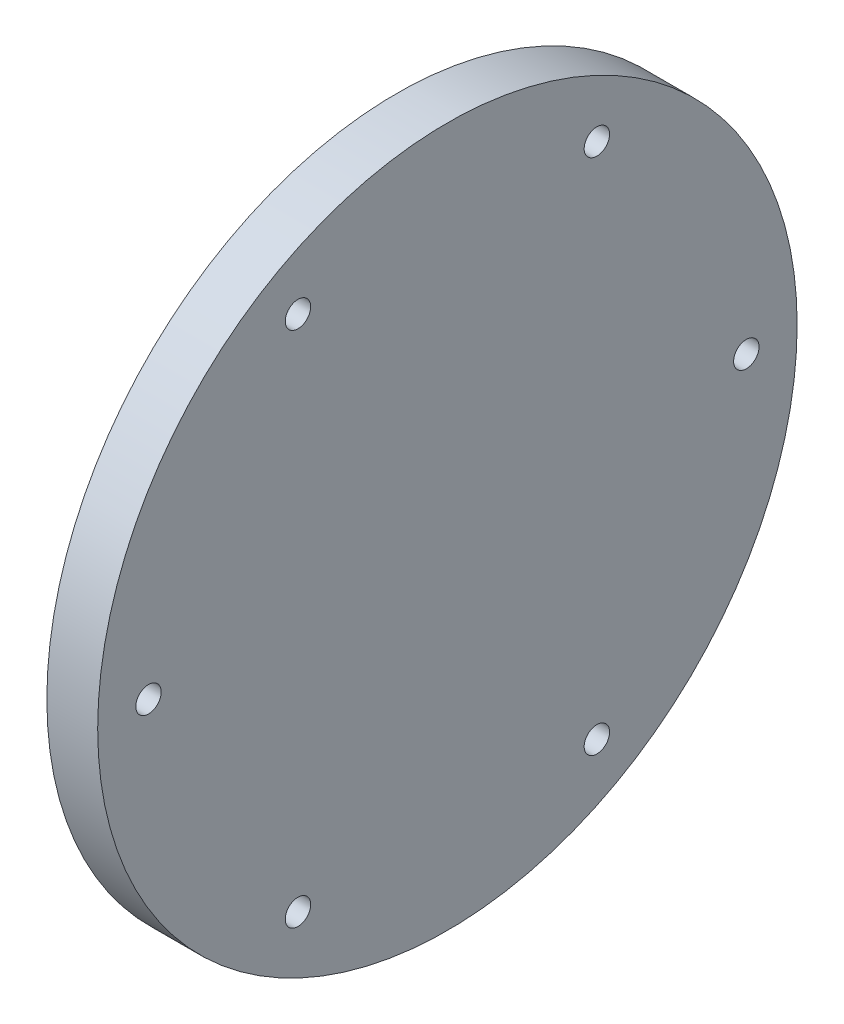
ISO-10303-21;
HEADER;
FILE_DESCRIPTION(('STEP AP214'),'2;1');
FILE_NAME('part.step','',(''),(''),'','','');
FILE_SCHEMA(('AUTOMOTIVE_DESIGN { 1 0 10303 214 1 1 1 1 }'));
ENDSEC;
DATA;
#1=APPLICATION_CONTEXT('core data for automotive mechanical design processes');
#2=APPLICATION_PROTOCOL_DEFINITION('international standard','automotive_design',2000,#1);
#3=PRODUCT_CONTEXT('',#1,'mechanical');
#4=PRODUCT('Part','Part','',(#3));
#5=PRODUCT_RELATED_PRODUCT_CATEGORY('part','',(#4));
#6=PRODUCT_DEFINITION_FORMATION('','',#4);
#7=PRODUCT_DEFINITION_CONTEXT('part definition',#1,'design');
#8=PRODUCT_DEFINITION('design','',#6,#7);
#9=PRODUCT_DEFINITION_SHAPE('','',#8);
#10=(LENGTH_UNIT() NAMED_UNIT(*) SI_UNIT(.MILLI.,.METRE.));
#11=(NAMED_UNIT(*) PLANE_ANGLE_UNIT() SI_UNIT($,.RADIAN.));
#12=(NAMED_UNIT(*) SI_UNIT($,.STERADIAN.) SOLID_ANGLE_UNIT());
#13=UNCERTAINTY_MEASURE_WITH_UNIT(LENGTH_MEASURE(1.E-05),#10,'distance_accuracy_value','');
#14=(GEOMETRIC_REPRESENTATION_CONTEXT(3) GLOBAL_UNCERTAINTY_ASSIGNED_CONTEXT((#13)) GLOBAL_UNIT_ASSIGNED_CONTEXT((#10,
#11,#12)) REPRESENTATION_CONTEXT('',''));
#15=CARTESIAN_POINT('',(0.,0.,0.));
#16=DIRECTION('',(0.,0.,1.));
#17=DIRECTION('',(1.,0.,0.));
#18=AXIS2_PLACEMENT_3D('',#15,#16,#17);
#19=CARTESIAN_POINT('',(163.7,34.4,0.));
#20=DIRECTION('',(1.,0.,0.));
#21=DIRECTION('',(0.,0.,-1.));
#22=AXIS2_PLACEMENT_3D('',#19,#20,#21);
#23=PLANE('',#22);
#24=CARTESIAN_POINT('',(163.7,0.,29.4));
#25=DIRECTION('',(1.,0.,0.));
#26=DIRECTION('',(0.,0.,-1.));
#27=AXIS2_PLACEMENT_3D('',#24,#25,#26);
#28=CIRCLE('',#27,1.25);
#29=CARTESIAN_POINT('',(163.7,0.,28.15));
#30=VERTEX_POINT('',#29);
#31=EDGE_CURVE('E50',#30,#30,#28,.F.);
#32=ORIENTED_EDGE('',*,*,#31,.F.);
#33=EDGE_LOOP('',(#32));
#34=FACE_BOUND('',#33,.T.);
#35=CARTESIAN_POINT('',(163.7,-25.4611468712625,14.7));
#36=DIRECTION('',(1.,0.,0.));
#37=DIRECTION('',(0.,0.,-1.));
#38=AXIS2_PLACEMENT_3D('',#35,#36,#37);
#39=CIRCLE('',#38,1.25);
#40=CARTESIAN_POINT('',(163.7,-25.4611468712625,13.45));
#41=VERTEX_POINT('',#40);
#42=EDGE_CURVE('E54',#41,#41,#39,.F.);
#43=ORIENTED_EDGE('',*,*,#42,.F.);
#44=EDGE_LOOP('',(#43));
#45=FACE_BOUND('',#44,.T.);
#46=CARTESIAN_POINT('',(163.7,-25.4611468712625,-14.7));
#47=DIRECTION('',(1.,0.,0.));
#48=DIRECTION('',(0.,0.,-1.));
#49=AXIS2_PLACEMENT_3D('',#46,#47,#48);
#50=CIRCLE('',#49,1.25);
#51=CARTESIAN_POINT('',(163.7,-25.4611468712625,-15.95));
#52=VERTEX_POINT('',#51);
#53=EDGE_CURVE('E59',#52,#52,#50,.F.);
#54=ORIENTED_EDGE('',*,*,#53,.F.);
#55=EDGE_LOOP('',(#54));
#56=FACE_BOUND('',#55,.T.);
#57=CARTESIAN_POINT('',(163.7,25.4611468712625,-14.7));
#58=DIRECTION('',(1.,0.,0.));
#59=DIRECTION('',(0.,0.,-1.));
#60=AXIS2_PLACEMENT_3D('',#57,#58,#59);
#61=CIRCLE('',#60,1.25);
#62=CARTESIAN_POINT('',(163.7,25.4611468712625,-15.95));
#63=VERTEX_POINT('',#62);
#64=EDGE_CURVE('E62',#63,#63,#61,.F.);
#65=ORIENTED_EDGE('',*,*,#64,.F.);
#66=EDGE_LOOP('',(#65));
#67=FACE_BOUND('',#66,.T.);
#68=CARTESIAN_POINT('',(163.7,0.,-29.4));
#69=DIRECTION('',(1.,0.,0.));
#70=DIRECTION('',(0.,0.,-1.));
#71=AXIS2_PLACEMENT_3D('',#68,#69,#70);
#72=CIRCLE('',#71,1.25);
#73=CARTESIAN_POINT('',(163.7,0.,-30.65));
#74=VERTEX_POINT('',#73);
#75=EDGE_CURVE('E65',#74,#74,#72,.F.);
#76=ORIENTED_EDGE('',*,*,#75,.F.);
#77=EDGE_LOOP('',(#76));
#78=FACE_BOUND('',#77,.T.);
#79=CARTESIAN_POINT('',(163.7,25.4611468712625,14.7));
#80=DIRECTION('',(1.,0.,0.));
#81=DIRECTION('',(0.,0.,-1.));
#82=AXIS2_PLACEMENT_3D('',#79,#80,#81);
#83=CIRCLE('',#82,1.25);
#84=CARTESIAN_POINT('',(163.7,25.4611468712625,13.45));
#85=VERTEX_POINT('',#84);
#86=EDGE_CURVE('E68',#85,#85,#83,.F.);
#87=ORIENTED_EDGE('',*,*,#86,.F.);
#88=EDGE_LOOP('',(#87));
#89=FACE_BOUND('',#88,.T.);
#90=CARTESIAN_POINT('',(163.7,0.,0.));
#91=DIRECTION('',(-1.,0.,0.));
#92=DIRECTION('',(0.,0.,1.));
#93=AXIS2_PLACEMENT_3D('',#90,#91,#92);
#94=CIRCLE('',#93,34.4);
#95=CARTESIAN_POINT('',(163.7,0.,34.4));
#96=VERTEX_POINT('',#95);
#97=EDGE_CURVE('E46',#96,#96,#94,.T.);
#98=ORIENTED_EDGE('',*,*,#97,.T.);
#99=EDGE_LOOP('',(#98));
#100=FACE_BOUND('',#99,.T.);
#101=ADVANCED_FACE('F39',(#34,#45,#56,#67,#78,#89,#100),#23,.F.);
#102=CARTESIAN_POINT('',(168.7,0.,0.));
#103=DIRECTION('',(-1.,0.,0.));
#104=DIRECTION('',(0.,0.,1.));
#105=AXIS2_PLACEMENT_3D('',#102,#103,#104);
#106=PLANE('',#105);
#107=CARTESIAN_POINT('',(168.7,0.,29.4));
#108=DIRECTION('',(1.,0.,0.));
#109=DIRECTION('',(0.,0.,-1.));
#110=AXIS2_PLACEMENT_3D('',#107,#108,#109);
#111=CIRCLE('',#110,1.25);
#112=CARTESIAN_POINT('',(168.7,0.,28.15));
#113=VERTEX_POINT('',#112);
#114=EDGE_CURVE('E71',#113,#113,#111,.T.);
#115=ORIENTED_EDGE('',*,*,#114,.F.);
#116=EDGE_LOOP('',(#115));
#117=FACE_BOUND('',#116,.T.);
#118=CARTESIAN_POINT('',(168.7,-25.4611468712625,14.7));
#119=DIRECTION('',(1.,0.,0.));
#120=DIRECTION('',(0.,0.,-1.));
#121=AXIS2_PLACEMENT_3D('',#118,#119,#120);
#122=CIRCLE('',#121,1.25);
#123=CARTESIAN_POINT('',(168.7,-25.4611468712625,13.45));
#124=VERTEX_POINT('',#123);
#125=EDGE_CURVE('E82',#124,#124,#122,.T.);
#126=ORIENTED_EDGE('',*,*,#125,.F.);
#127=EDGE_LOOP('',(#126));
#128=FACE_BOUND('',#127,.T.);
#129=CARTESIAN_POINT('',(168.7,-25.4611468712625,-14.7));
#130=DIRECTION('',(1.,0.,0.));
#131=DIRECTION('',(0.,0.,-1.));
#132=AXIS2_PLACEMENT_3D('',#129,#130,#131);
#133=CIRCLE('',#132,1.25);
#134=CARTESIAN_POINT('',(168.7,-25.4611468712625,-15.95));
#135=VERTEX_POINT('',#134);
#136=EDGE_CURVE('E75',#135,#135,#133,.T.);
#137=ORIENTED_EDGE('',*,*,#136,.F.);
#138=EDGE_LOOP('',(#137));
#139=FACE_BOUND('',#138,.T.);
#140=CARTESIAN_POINT('',(168.7,25.4611468712625,-14.7));
#141=DIRECTION('',(1.,0.,0.));
#142=DIRECTION('',(0.,0.,-1.));
#143=AXIS2_PLACEMENT_3D('',#140,#141,#142);
#144=CIRCLE('',#143,1.25);
#145=CARTESIAN_POINT('',(168.7,25.4611468712625,-15.95));
#146=VERTEX_POINT('',#145);
#147=EDGE_CURVE('E72',#146,#146,#144,.T.);
#148=ORIENTED_EDGE('',*,*,#147,.F.);
#149=EDGE_LOOP('',(#148));
#150=FACE_BOUND('',#149,.T.);
#151=CARTESIAN_POINT('',(168.7,0.,-29.4));
#152=DIRECTION('',(1.,0.,0.));
#153=DIRECTION('',(0.,0.,-1.));
#154=AXIS2_PLACEMENT_3D('',#151,#152,#153);
#155=CIRCLE('',#154,1.25);
#156=CARTESIAN_POINT('',(168.7,0.,-30.65));
#157=VERTEX_POINT('',#156);
#158=EDGE_CURVE('E76',#157,#157,#155,.T.);
#159=ORIENTED_EDGE('',*,*,#158,.F.);
#160=EDGE_LOOP('',(#159));
#161=FACE_BOUND('',#160,.T.);
#162=CARTESIAN_POINT('',(168.7,25.4611468712625,14.7));
#163=DIRECTION('',(1.,0.,0.));
#164=DIRECTION('',(0.,0.,-1.));
#165=AXIS2_PLACEMENT_3D('',#162,#163,#164);
#166=CIRCLE('',#165,1.25);
#167=CARTESIAN_POINT('',(168.7,25.4611468712625,13.45));
#168=VERTEX_POINT('',#167);
#169=EDGE_CURVE('E79',#168,#168,#166,.T.);
#170=ORIENTED_EDGE('',*,*,#169,.F.);
#171=EDGE_LOOP('',(#170));
#172=FACE_BOUND('',#171,.T.);
#173=CARTESIAN_POINT('',(168.7,0.,0.));
#174=DIRECTION('',(-1.,0.,0.));
#175=DIRECTION('',(0.,0.,1.));
#176=AXIS2_PLACEMENT_3D('',#173,#174,#175);
#177=CIRCLE('',#176,34.4);
#178=CARTESIAN_POINT('',(168.7,0.,34.4));
#179=VERTEX_POINT('',#178);
#180=EDGE_CURVE('E10',#179,#179,#177,.T.);
#181=ORIENTED_EDGE('',*,*,#180,.F.);
#182=EDGE_LOOP('',(#181));
#183=FACE_BOUND('',#182,.T.);
#184=ADVANCED_FACE('F93',(#117,#128,#139,#150,#161,#172,#183),#106,.F.);
#185=CARTESIAN_POINT('',(-110.,0.,0.));
#186=DIRECTION('',(-1.,0.,0.));
#187=DIRECTION('',(0.,0.,1.));
#188=AXIS2_PLACEMENT_3D('',#185,#186,#187);
#189=CYLINDRICAL_SURFACE('',#188,34.4);
#190=ORIENTED_EDGE('',*,*,#97,.F.);
#191=EDGE_LOOP('',(#190));
#192=FACE_BOUND('',#191,.T.);
#193=ORIENTED_EDGE('',*,*,#180,.T.);
#194=EDGE_LOOP('',(#193));
#195=FACE_BOUND('',#194,.T.);
#196=ADVANCED_FACE('F96',(#192,#195),#189,.T.);
#197=CARTESIAN_POINT('',(168.7,25.4611468712625,14.7));
#198=DIRECTION('',(-1.,0.,0.));
#199=DIRECTION('',(0.,0.,1.));
#200=AXIS2_PLACEMENT_3D('',#197,#198,#199);
#201=CYLINDRICAL_SURFACE('',#200,1.25);
#202=ORIENTED_EDGE('',*,*,#169,.T.);
#203=EDGE_LOOP('',(#202));
#204=FACE_BOUND('',#203,.T.);
#205=ORIENTED_EDGE('',*,*,#86,.T.);
#206=EDGE_LOOP('',(#205));
#207=FACE_BOUND('',#206,.T.);
#208=ADVANCED_FACE('F108',(#204,#207),#201,.F.);
#209=CARTESIAN_POINT('',(168.7,0.,-29.4));
#210=DIRECTION('',(-1.,0.,0.));
#211=DIRECTION('',(0.,0.,1.));
#212=AXIS2_PLACEMENT_3D('',#209,#210,#211);
#213=CYLINDRICAL_SURFACE('',#212,1.25);
#214=ORIENTED_EDGE('',*,*,#158,.T.);
#215=EDGE_LOOP('',(#214));
#216=FACE_BOUND('',#215,.T.);
#217=ORIENTED_EDGE('',*,*,#75,.T.);
#218=EDGE_LOOP('',(#217));
#219=FACE_BOUND('',#218,.T.);
#220=ADVANCED_FACE('F111',(#216,#219),#213,.F.);
#221=CARTESIAN_POINT('',(168.7,25.4611468712625,-14.7));
#222=DIRECTION('',(-1.,0.,0.));
#223=DIRECTION('',(0.,0.,1.));
#224=AXIS2_PLACEMENT_3D('',#221,#222,#223);
#225=CYLINDRICAL_SURFACE('',#224,1.25);
#226=ORIENTED_EDGE('',*,*,#147,.T.);
#227=EDGE_LOOP('',(#226));
#228=FACE_BOUND('',#227,.T.);
#229=ORIENTED_EDGE('',*,*,#64,.T.);
#230=EDGE_LOOP('',(#229));
#231=FACE_BOUND('',#230,.T.);
#232=ADVANCED_FACE('F130',(#228,#231),#225,.F.);
#233=CARTESIAN_POINT('',(168.7,-25.4611468712625,-14.7));
#234=DIRECTION('',(-1.,0.,0.));
#235=DIRECTION('',(0.,0.,1.));
#236=AXIS2_PLACEMENT_3D('',#233,#234,#235);
#237=CYLINDRICAL_SURFACE('',#236,1.25);
#238=ORIENTED_EDGE('',*,*,#136,.T.);
#239=EDGE_LOOP('',(#238));
#240=FACE_BOUND('',#239,.T.);
#241=ORIENTED_EDGE('',*,*,#53,.T.);
#242=EDGE_LOOP('',(#241));
#243=FACE_BOUND('',#242,.T.);
#244=ADVANCED_FACE('F136',(#240,#243),#237,.F.);
#245=CARTESIAN_POINT('',(168.7,-25.4611468712625,14.7));
#246=DIRECTION('',(-1.,0.,0.));
#247=DIRECTION('',(0.,0.,1.));
#248=AXIS2_PLACEMENT_3D('',#245,#246,#247);
#249=CYLINDRICAL_SURFACE('',#248,1.25);
#250=ORIENTED_EDGE('',*,*,#125,.T.);
#251=EDGE_LOOP('',(#250));
#252=FACE_BOUND('',#251,.T.);
#253=ORIENTED_EDGE('',*,*,#42,.T.);
#254=EDGE_LOOP('',(#253));
#255=FACE_BOUND('',#254,.T.);
#256=ADVANCED_FACE('F144',(#252,#255),#249,.F.);
#257=CARTESIAN_POINT('',(168.7,0.,29.4));
#258=DIRECTION('',(-1.,0.,0.));
#259=DIRECTION('',(0.,0.,1.));
#260=AXIS2_PLACEMENT_3D('',#257,#258,#259);
#261=CYLINDRICAL_SURFACE('',#260,1.25);
#262=ORIENTED_EDGE('',*,*,#114,.T.);
#263=EDGE_LOOP('',(#262));
#264=FACE_BOUND('',#263,.T.);
#265=ORIENTED_EDGE('',*,*,#31,.T.);
#266=EDGE_LOOP('',(#265));
#267=FACE_BOUND('',#266,.T.);
#268=ADVANCED_FACE('F90',(#264,#267),#261,.F.);
#269=CLOSED_SHELL('',(#101,#184,#196,#208,#220,#232,#244,#256,#268));
#270=MANIFOLD_SOLID_BREP('B2',#269);
#271=ADVANCED_BREP_SHAPE_REPRESENTATION('',(#18,#270),#14);
#272=SHAPE_DEFINITION_REPRESENTATION(#9,#271);
ENDSEC;
END-ISO-10303-21;
